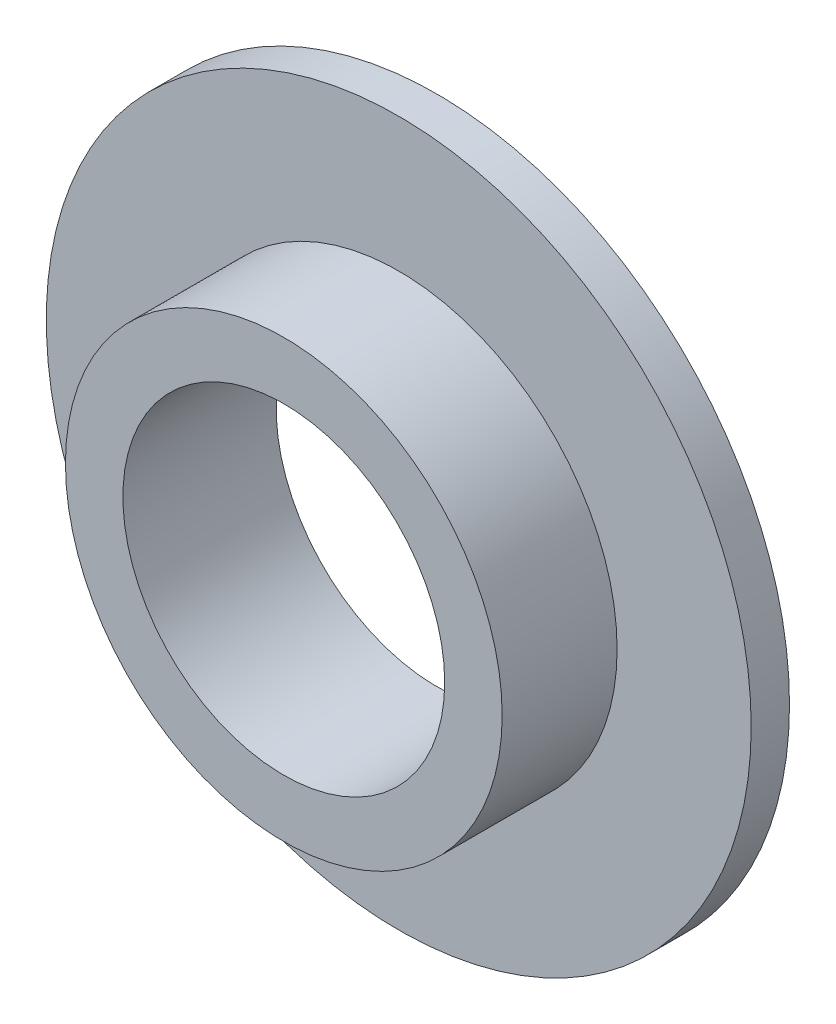
ISO-10303-21;
HEADER;
FILE_DESCRIPTION(('STEP AP214'),'2;1');
FILE_NAME('part.step','',(''),(''),'','','');
FILE_SCHEMA(('AUTOMOTIVE_DESIGN { 1 0 10303 214 1 1 1 1 }'));
ENDSEC;
DATA;
#1=APPLICATION_CONTEXT('core data for automotive mechanical design processes');
#2=APPLICATION_PROTOCOL_DEFINITION('international standard','automotive_design',2000,#1);
#3=PRODUCT_CONTEXT('',#1,'mechanical');
#4=PRODUCT('Part','Part','',(#3));
#5=PRODUCT_RELATED_PRODUCT_CATEGORY('part','',(#4));
#6=PRODUCT_DEFINITION_FORMATION('','',#4);
#7=PRODUCT_DEFINITION_CONTEXT('part definition',#1,'design');
#8=PRODUCT_DEFINITION('design','',#6,#7);
#9=PRODUCT_DEFINITION_SHAPE('','',#8);
#10=(LENGTH_UNIT() NAMED_UNIT(*) SI_UNIT(.MILLI.,.METRE.));
#11=(NAMED_UNIT(*) PLANE_ANGLE_UNIT() SI_UNIT($,.RADIAN.));
#12=(NAMED_UNIT(*) SI_UNIT($,.STERADIAN.) SOLID_ANGLE_UNIT());
#13=UNCERTAINTY_MEASURE_WITH_UNIT(LENGTH_MEASURE(1.E-05),#10,'distance_accuracy_value','');
#14=(GEOMETRIC_REPRESENTATION_CONTEXT(3) GLOBAL_UNCERTAINTY_ASSIGNED_CONTEXT((#13)) GLOBAL_UNIT_ASSIGNED_CONTEXT((#10,
#11,#12)) REPRESENTATION_CONTEXT('',''));
#15=CARTESIAN_POINT('',(0.,0.,0.));
#16=DIRECTION('',(0.,0.,1.));
#17=DIRECTION('',(1.,0.,0.));
#18=AXIS2_PLACEMENT_3D('',#15,#16,#17);
#19=CARTESIAN_POINT('',(0.,0.,1.));
#20=DIRECTION('',(0.,0.,1.));
#21=DIRECTION('',(1.,0.,0.));
#22=AXIS2_PLACEMENT_3D('',#19,#20,#21);
#23=PLANE('',#22);
#24=CARTESIAN_POINT('',(0.,0.,1.));
#25=DIRECTION('',(0.,0.,1.));
#26=DIRECTION('',(1.,0.,0.));
#27=AXIS2_PLACEMENT_3D('',#24,#25,#26);
#28=CIRCLE('',#27,18.4);
#29=CARTESIAN_POINT('',(18.4,0.,1.));
#30=VERTEX_POINT('',#29);
#31=EDGE_CURVE('E10',#30,#30,#28,.T.);
#32=ORIENTED_EDGE('',*,*,#31,.T.);
#33=EDGE_LOOP('',(#32));
#34=FACE_BOUND('',#33,.T.);
#35=CARTESIAN_POINT('',(0.,0.,1.));
#36=DIRECTION('',(0.,0.,1.));
#37=DIRECTION('',(1.,0.,0.));
#38=AXIS2_PLACEMENT_3D('',#35,#36,#37);
#39=CIRCLE('',#38,11.4);
#40=CARTESIAN_POINT('',(11.4,0.,1.));
#41=VERTEX_POINT('',#40);
#42=EDGE_CURVE('E47',#41,#41,#39,.T.);
#43=ORIENTED_EDGE('',*,*,#42,.F.);
#44=EDGE_LOOP('',(#43));
#45=FACE_BOUND('',#44,.T.);
#46=ADVANCED_FACE('F31',(#34,#45),#23,.T.);
#47=CARTESIAN_POINT('',(0.,0.,-1.));
#48=DIRECTION('',(0.,0.,1.));
#49=DIRECTION('',(1.,0.,0.));
#50=AXIS2_PLACEMENT_3D('',#47,#48,#49);
#51=PLANE('',#50);
#52=CARTESIAN_POINT('',(0.,0.,-1.));
#53=DIRECTION('',(0.,0.,1.));
#54=DIRECTION('',(1.,0.,0.));
#55=AXIS2_PLACEMENT_3D('',#52,#53,#54);
#56=CIRCLE('',#55,18.4);
#57=CARTESIAN_POINT('',(18.4,0.,-1.));
#58=VERTEX_POINT('',#57);
#59=EDGE_CURVE('E35',#58,#58,#56,.T.);
#60=ORIENTED_EDGE('',*,*,#59,.F.);
#61=EDGE_LOOP('',(#60));
#62=FACE_BOUND('',#61,.T.);
#63=CARTESIAN_POINT('',(0.,0.,-1.));
#64=DIRECTION('',(0.,0.,1.));
#65=DIRECTION('',(1.,0.,0.));
#66=AXIS2_PLACEMENT_3D('',#63,#64,#65);
#67=CIRCLE('',#66,8.4);
#68=CARTESIAN_POINT('',(8.4,0.,-1.));
#69=VERTEX_POINT('',#68);
#70=EDGE_CURVE('E42',#69,#69,#67,.T.);
#71=ORIENTED_EDGE('',*,*,#70,.T.);
#72=EDGE_LOOP('',(#71));
#73=FACE_BOUND('',#72,.T.);
#74=ADVANCED_FACE('F72',(#62,#73),#51,.F.);
#75=CARTESIAN_POINT('',(0.,0.,1.));
#76=DIRECTION('',(0.,0.,-1.));
#77=DIRECTION('',(-1.,0.,0.));
#78=AXIS2_PLACEMENT_3D('',#75,#76,#77);
#79=CYLINDRICAL_SURFACE('',#78,18.4);
#80=ORIENTED_EDGE('',*,*,#31,.F.);
#81=EDGE_LOOP('',(#80));
#82=FACE_BOUND('',#81,.T.);
#83=ORIENTED_EDGE('',*,*,#59,.T.);
#84=EDGE_LOOP('',(#83));
#85=FACE_BOUND('',#84,.T.);
#86=ADVANCED_FACE('F33',(#82,#85),#79,.T.);
#87=CARTESIAN_POINT('',(0.,0.,1.));
#88=DIRECTION('',(0.,0.,-1.));
#89=DIRECTION('',(-1.,0.,0.));
#90=AXIS2_PLACEMENT_3D('',#87,#88,#89);
#91=CYLINDRICAL_SURFACE('',#90,8.4);
#92=ORIENTED_EDGE('',*,*,#70,.F.);
#93=EDGE_LOOP('',(#92));
#94=FACE_BOUND('',#93,.T.);
#95=CARTESIAN_POINT('',(0.,0.,7.));
#96=DIRECTION('',(0.,0.,1.));
#97=DIRECTION('',(1.,0.,0.));
#98=AXIS2_PLACEMENT_3D('',#95,#96,#97);
#99=CIRCLE('',#98,8.4);
#100=CARTESIAN_POINT('',(8.4,0.,7.));
#101=VERTEX_POINT('',#100);
#102=EDGE_CURVE('E50',#101,#101,#99,.T.);
#103=ORIENTED_EDGE('',*,*,#102,.T.);
#104=EDGE_LOOP('',(#103));
#105=FACE_BOUND('',#104,.T.);
#106=ADVANCED_FACE('F56',(#94,#105),#91,.F.);
#107=CARTESIAN_POINT('',(0.,0.,7.));
#108=DIRECTION('',(0.,0.,1.));
#109=DIRECTION('',(1.,0.,0.));
#110=AXIS2_PLACEMENT_3D('',#107,#108,#109);
#111=PLANE('',#110);
#112=CARTESIAN_POINT('',(0.,0.,7.));
#113=DIRECTION('',(0.,0.,1.));
#114=DIRECTION('',(1.,0.,0.));
#115=AXIS2_PLACEMENT_3D('',#112,#113,#114);
#116=CIRCLE('',#115,11.4);
#117=CARTESIAN_POINT('',(11.4,0.,7.));
#118=VERTEX_POINT('',#117);
#119=EDGE_CURVE('E46',#118,#118,#116,.T.);
#120=ORIENTED_EDGE('',*,*,#119,.T.);
#121=EDGE_LOOP('',(#120));
#122=FACE_BOUND('',#121,.T.);
#123=ORIENTED_EDGE('',*,*,#102,.F.);
#124=EDGE_LOOP('',(#123));
#125=FACE_BOUND('',#124,.T.);
#126=ADVANCED_FACE('F58',(#122,#125),#111,.T.);
#127=CARTESIAN_POINT('',(0.,0.,7.));
#128=DIRECTION('',(0.,0.,-1.));
#129=DIRECTION('',(-1.,0.,0.));
#130=AXIS2_PLACEMENT_3D('',#127,#128,#129);
#131=CYLINDRICAL_SURFACE('',#130,11.4);
#132=ORIENTED_EDGE('',*,*,#119,.F.);
#133=EDGE_LOOP('',(#132));
#134=FACE_BOUND('',#133,.T.);
#135=ORIENTED_EDGE('',*,*,#42,.T.);
#136=EDGE_LOOP('',(#135));
#137=FACE_BOUND('',#136,.T.);
#138=ADVANCED_FACE('F60',(#134,#137),#131,.T.);
#139=CLOSED_SHELL('',(#46,#74,#86,#106,#126,#138));
#140=MANIFOLD_SOLID_BREP('B2',#139);
#141=ADVANCED_BREP_SHAPE_REPRESENTATION('',(#18,#140),#14);
#142=SHAPE_DEFINITION_REPRESENTATION(#9,#141);
ENDSEC;
END-ISO-10303-21;
